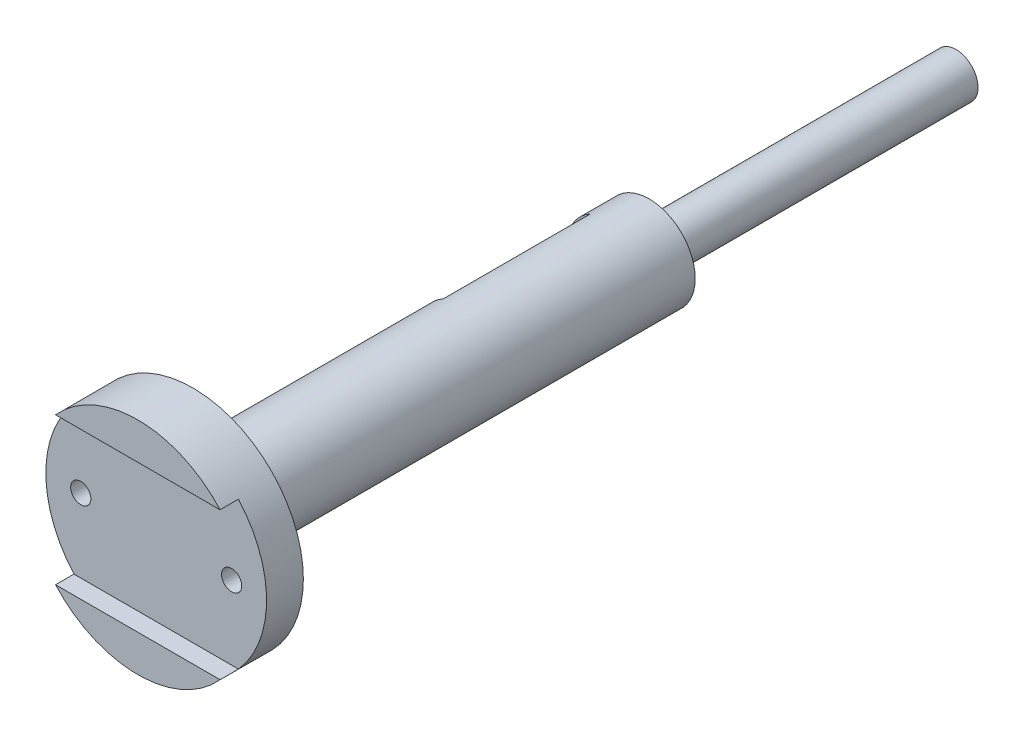
ISO-10303-21;
HEADER;
FILE_DESCRIPTION(('STEP AP214'),'2;1');
FILE_NAME('part.step','',(''),(''),'','','');
FILE_SCHEMA(('AUTOMOTIVE_DESIGN { 1 0 10303 214 1 1 1 1 }'));
ENDSEC;
DATA;
#1=APPLICATION_CONTEXT('core data for automotive mechanical design processes');
#2=APPLICATION_PROTOCOL_DEFINITION('international standard','automotive_design',2000,#1);
#3=PRODUCT_CONTEXT('',#1,'mechanical');
#4=PRODUCT('Part','Part','',(#3));
#5=PRODUCT_RELATED_PRODUCT_CATEGORY('part','',(#4));
#6=PRODUCT_DEFINITION_FORMATION('','',#4);
#7=PRODUCT_DEFINITION_CONTEXT('part definition',#1,'design');
#8=PRODUCT_DEFINITION('design','',#6,#7);
#9=PRODUCT_DEFINITION_SHAPE('','',#8);
#10=(LENGTH_UNIT() NAMED_UNIT(*) SI_UNIT(.MILLI.,.METRE.));
#11=(NAMED_UNIT(*) PLANE_ANGLE_UNIT() SI_UNIT($,.RADIAN.));
#12=(NAMED_UNIT(*) SI_UNIT($,.STERADIAN.) SOLID_ANGLE_UNIT());
#13=UNCERTAINTY_MEASURE_WITH_UNIT(LENGTH_MEASURE(1.E-05),#10,'distance_accuracy_value','');
#14=(GEOMETRIC_REPRESENTATION_CONTEXT(3) GLOBAL_UNCERTAINTY_ASSIGNED_CONTEXT((#13)) GLOBAL_UNIT_ASSIGNED_CONTEXT((#10,
#11,#12)) REPRESENTATION_CONTEXT('',''));
#15=CARTESIAN_POINT('',(0.,0.,0.));
#16=DIRECTION('',(0.,0.,1.));
#17=DIRECTION('',(1.,0.,0.));
#18=AXIS2_PLACEMENT_3D('',#15,#16,#17);
#19=CARTESIAN_POINT('',(-6.,10.9658560997307,-74.));
#20=DIRECTION('',(1.,0.,0.));
#21=DIRECTION('',(0.,0.,-1.));
#22=AXIS2_PLACEMENT_3D('',#19,#20,#21);
#23=PLANE('',#22);
#24=DIRECTION('',(0.,1.,0.));
#25=VECTOR('',#24,1.);
#26=CARTESIAN_POINT('',(-6.,10.9658560997307,-114.));
#27=LINE('',#26,#25);
#28=CARTESIAN_POINT('',(-6.,-10.9658560997307,-114.));
#29=VERTEX_POINT('',#28);
#30=CARTESIAN_POINT('',(-6.,10.9658560997307,-114.));
#31=VERTEX_POINT('',#30);
#32=EDGE_CURVE('E11',#29,#31,#27,.T.);
#33=ORIENTED_EDGE('',*,*,#32,.F.);
#34=DIRECTION('',(0.,0.,-1.));
#35=VECTOR('',#34,1.);
#36=CARTESIAN_POINT('',(-6.,-10.9658560997307,-74.));
#37=LINE('',#36,#35);
#38=CARTESIAN_POINT('',(-6.,-10.9658560997307,-74.));
#39=VERTEX_POINT('',#38);
#40=EDGE_CURVE('E113',#39,#29,#37,.T.);
#41=ORIENTED_EDGE('',*,*,#40,.F.);
#42=DIRECTION('',(0.,-1.,0.));
#43=VECTOR('',#42,1.);
#44=CARTESIAN_POINT('',(-6.,10.9658560997307,-74.));
#45=LINE('',#44,#43);
#46=CARTESIAN_POINT('',(-6.,10.9658560997307,-74.));
#47=VERTEX_POINT('',#46);
#48=EDGE_CURVE('E110',#47,#39,#45,.T.);
#49=ORIENTED_EDGE('',*,*,#48,.F.);
#50=DIRECTION('',(0.,0.,-1.));
#51=VECTOR('',#50,1.);
#52=CARTESIAN_POINT('',(-6.,10.9658560997307,-74.));
#53=LINE('',#52,#51);
#54=EDGE_CURVE('E50',#47,#31,#53,.T.);
#55=ORIENTED_EDGE('',*,*,#54,.T.);
#56=EDGE_LOOP('',(#33,#41,#49,#55));
#57=FACE_BOUND('',#56,.T.);
#58=ADVANCED_FACE('F35',(#57),#23,.F.);
#59=CARTESIAN_POINT('',(0.,0.,15.));
#60=DIRECTION('',(0.,0.,1.));
#61=DIRECTION('',(1.,0.,0.));
#62=AXIS2_PLACEMENT_3D('',#59,#60,#61);
#63=PLANE('',#62);
#64=DIRECTION('',(-1.,0.,0.));
#65=VECTOR('',#64,1.);
#66=CARTESIAN_POINT('',(0.,20.,15.));
#67=LINE('',#66,#65);
#68=CARTESIAN_POINT('',(22.3606797749979,20.,15.));
#69=VERTEX_POINT('',#68);
#70=CARTESIAN_POINT('',(-22.3606797749979,20.,15.));
#71=VERTEX_POINT('',#70);
#72=EDGE_CURVE('E212',#69,#71,#67,.T.);
#73=ORIENTED_EDGE('',*,*,#72,.F.);
#74=CARTESIAN_POINT('',(0.,0.,15.));
#75=DIRECTION('',(0.,0.,1.));
#76=DIRECTION('',(1.,0.,0.));
#77=AXIS2_PLACEMENT_3D('',#74,#75,#76);
#78=CIRCLE('',#77,30.);
#79=EDGE_CURVE('E201',#69,#71,#78,.T.);
#80=ORIENTED_EDGE('',*,*,#79,.T.);
#81=EDGE_LOOP('',(#73,#80));
#82=FACE_BOUND('',#81,.T.);
#83=ADVANCED_FACE('F256',(#82),#63,.T.);
#84=CARTESIAN_POINT('',(0.,0.,15.));
#85=DIRECTION('',(0.,0.,-1.));
#86=DIRECTION('',(-1.,0.,0.));
#87=AXIS2_PLACEMENT_3D('',#84,#85,#86);
#88=CYLINDRICAL_SURFACE('',#87,30.);
#89=ORIENTED_EDGE('',*,*,#79,.F.);
#90=DIRECTION('',(0.,0.,-1.));
#91=VECTOR('',#90,1.);
#92=CARTESIAN_POINT('',(22.3606797749979,20.,15.));
#93=LINE('',#92,#91);
#94=CARTESIAN_POINT('',(22.3606797749979,20.,10.));
#95=VERTEX_POINT('',#94);
#96=EDGE_CURVE('E194',#69,#95,#93,.T.);
#97=ORIENTED_EDGE('',*,*,#96,.T.);
#98=CARTESIAN_POINT('',(0.,0.,10.));
#99=DIRECTION('',(0.,0.,-1.));
#100=DIRECTION('',(-1.,0.,0.));
#101=AXIS2_PLACEMENT_3D('',#98,#99,#100);
#102=CIRCLE('',#101,30.);
#103=CARTESIAN_POINT('',(22.3606797749979,-20.,10.));
#104=VERTEX_POINT('',#103);
#105=EDGE_CURVE('E217',#95,#104,#102,.T.);
#106=ORIENTED_EDGE('',*,*,#105,.T.);
#107=DIRECTION('',(0.,0.,-1.));
#108=VECTOR('',#107,1.);
#109=CARTESIAN_POINT('',(22.3606797749979,-20.,15.));
#110=LINE('',#109,#108);
#111=CARTESIAN_POINT('',(22.3606797749979,-20.,15.));
#112=VERTEX_POINT('',#111);
#113=EDGE_CURVE('E185',#104,#112,#110,.F.);
#114=ORIENTED_EDGE('',*,*,#113,.T.);
#115=CARTESIAN_POINT('',(-22.3606797749979,-20.,15.));
#116=VERTEX_POINT('',#115);
#117=EDGE_CURVE('E205',#116,#112,#78,.T.);
#118=ORIENTED_EDGE('',*,*,#117,.F.);
#119=DIRECTION('',(0.,0.,-1.));
#120=VECTOR('',#119,1.);
#121=CARTESIAN_POINT('',(-22.3606797749979,-20.,15.));
#122=LINE('',#121,#120);
#123=CARTESIAN_POINT('',(-22.3606797749979,-20.,10.));
#124=VERTEX_POINT('',#123);
#125=EDGE_CURVE('E188',#116,#124,#122,.T.);
#126=ORIENTED_EDGE('',*,*,#125,.T.);
#127=CARTESIAN_POINT('',(-22.3606797749979,20.,10.));
#128=VERTEX_POINT('',#127);
#129=EDGE_CURVE('E214',#124,#128,#102,.T.);
#130=ORIENTED_EDGE('',*,*,#129,.T.);
#131=DIRECTION('',(0.,0.,-1.));
#132=VECTOR('',#131,1.);
#133=CARTESIAN_POINT('',(-22.3606797749979,20.,15.));
#134=LINE('',#133,#132);
#135=EDGE_CURVE('E191',#128,#71,#134,.F.);
#136=ORIENTED_EDGE('',*,*,#135,.T.);
#137=EDGE_LOOP('',(#89,#97,#106,#114,#118,#126,#130,#136));
#138=FACE_BOUND('',#137,.T.);
#139=CARTESIAN_POINT('',(0.,0.,0.));
#140=DIRECTION('',(0.,0.,1.));
#141=DIRECTION('',(1.,0.,0.));
#142=AXIS2_PLACEMENT_3D('',#139,#140,#141);
#143=CIRCLE('',#142,30.);
#144=CARTESIAN_POINT('',(30.,0.,0.));
#145=VERTEX_POINT('',#144);
#146=EDGE_CURVE('E200',#145,#145,#143,.T.);
#147=ORIENTED_EDGE('',*,*,#146,.T.);
#148=EDGE_LOOP('',(#147));
#149=FACE_BOUND('',#148,.T.);
#150=ADVANCED_FACE('F37',(#138,#149),#88,.T.);
#151=DIRECTION('',(1.,0.,0.));
#152=VECTOR('',#151,1.);
#153=CARTESIAN_POINT('',(0.,-20.,15.));
#154=LINE('',#153,#152);
#155=EDGE_CURVE('E210',#116,#112,#154,.T.);
#156=ORIENTED_EDGE('',*,*,#155,.F.);
#157=ORIENTED_EDGE('',*,*,#117,.T.);
#158=EDGE_LOOP('',(#156,#157));
#159=FACE_BOUND('',#158,.T.);
#160=ADVANCED_FACE('F263',(#159),#63,.T.);
#161=CARTESIAN_POINT('',(0.,0.,0.));
#162=DIRECTION('',(0.,0.,1.));
#163=DIRECTION('',(1.,0.,0.));
#164=AXIS2_PLACEMENT_3D('',#161,#162,#163);
#165=PLANE('',#164);
#166=CARTESIAN_POINT('',(-20.5,0.,0.));
#167=DIRECTION('',(0.,0.,-1.));
#168=DIRECTION('',(-1.,0.,0.));
#169=AXIS2_PLACEMENT_3D('',#166,#167,#168);
#170=CIRCLE('',#169,6.12);
#171=CARTESIAN_POINT('',(-26.62,0.,0.));
#172=VERTEX_POINT('',#171);
#173=EDGE_CURVE('E151',#172,#172,#170,.T.);
#174=ORIENTED_EDGE('',*,*,#173,.F.);
#175=EDGE_LOOP('',(#174));
#176=FACE_BOUND('',#175,.T.);
#177=CARTESIAN_POINT('',(20.5,0.,0.));
#178=DIRECTION('',(0.,0.,-1.));
#179=DIRECTION('',(-1.,0.,0.));
#180=AXIS2_PLACEMENT_3D('',#177,#178,#179);
#181=CIRCLE('',#180,6.12);
#182=CARTESIAN_POINT('',(14.38,0.,0.));
#183=VERTEX_POINT('',#182);
#184=EDGE_CURVE('E166',#183,#183,#181,.T.);
#185=ORIENTED_EDGE('',*,*,#184,.F.);
#186=EDGE_LOOP('',(#185));
#187=FACE_BOUND('',#186,.T.);
#188=CARTESIAN_POINT('',(0.,0.,0.));
#189=DIRECTION('',(0.,0.,1.));
#190=DIRECTION('',(1.,0.,0.));
#191=AXIS2_PLACEMENT_3D('',#188,#189,#190);
#192=CIRCLE('',#191,12.5);
#193=CARTESIAN_POINT('',(12.5,0.,0.));
#194=VERTEX_POINT('',#193);
#195=EDGE_CURVE('E204',#194,#194,#192,.F.);
#196=ORIENTED_EDGE('',*,*,#195,.F.);
#197=EDGE_LOOP('',(#196));
#198=FACE_BOUND('',#197,.T.);
#199=ORIENTED_EDGE('',*,*,#146,.F.);
#200=EDGE_LOOP('',(#199));
#201=FACE_BOUND('',#200,.T.);
#202=ADVANCED_FACE('F411',(#176,#187,#198,#201),#165,.F.);
#203=CARTESIAN_POINT('',(0.,0.,-124.));
#204=DIRECTION('',(0.,0.,1.));
#205=DIRECTION('',(1.,0.,0.));
#206=AXIS2_PLACEMENT_3D('',#203,#204,#205);
#207=CYLINDRICAL_SURFACE('',#206,12.5);
#208=CARTESIAN_POINT('',(0.,0.,-124.));
#209=DIRECTION('',(0.,0.,-1.));
#210=DIRECTION('',(-1.,0.,0.));
#211=AXIS2_PLACEMENT_3D('',#208,#209,#210);
#212=CIRCLE('',#211,12.5);
#213=CARTESIAN_POINT('',(-12.5,0.,-124.));
#214=VERTEX_POINT('',#213);
#215=EDGE_CURVE('E197',#214,#214,#212,.T.);
#216=ORIENTED_EDGE('',*,*,#215,.F.);
#217=EDGE_LOOP('',(#216));
#218=FACE_BOUND('',#217,.T.);
#219=CARTESIAN_POINT('',(0.,0.,-114.));
#220=DIRECTION('',(0.,0.,-1.));
#221=DIRECTION('',(-1.,0.,0.));
#222=AXIS2_PLACEMENT_3D('',#219,#220,#221);
#223=CIRCLE('',#222,12.5);
#224=EDGE_CURVE('E114',#29,#31,#223,.T.);
#225=ORIENTED_EDGE('',*,*,#224,.T.);
#226=ORIENTED_EDGE('',*,*,#54,.F.);
#227=CARTESIAN_POINT('',(0.,0.,-74.));
#228=DIRECTION('',(0.,0.,1.));
#229=DIRECTION('',(1.,0.,0.));
#230=AXIS2_PLACEMENT_3D('',#227,#228,#229);
#231=CIRCLE('',#230,12.5);
#232=EDGE_CURVE('E43',#47,#39,#231,.T.);
#233=ORIENTED_EDGE('',*,*,#232,.T.);
#234=ORIENTED_EDGE('',*,*,#40,.T.);
#235=EDGE_LOOP('',(#225,#226,#233,#234));
#236=FACE_BOUND('',#235,.T.);
#237=ORIENTED_EDGE('',*,*,#195,.T.);
#238=EDGE_LOOP('',(#237));
#239=FACE_BOUND('',#238,.T.);
#240=ADVANCED_FACE('F117',(#218,#236,#239),#207,.T.);
#241=CARTESIAN_POINT('',(0.,0.,-124.));
#242=DIRECTION('',(0.,0.,-1.));
#243=DIRECTION('',(-1.,0.,0.));
#244=AXIS2_PLACEMENT_3D('',#241,#242,#243);
#245=PLANE('',#244);
#246=ORIENTED_EDGE('',*,*,#215,.T.);
#247=EDGE_LOOP('',(#246));
#248=FACE_BOUND('',#247,.T.);
#249=CARTESIAN_POINT('',(0.,0.,-124.));
#250=DIRECTION('',(0.,0.,-1.));
#251=DIRECTION('',(-1.,0.,0.));
#252=AXIS2_PLACEMENT_3D('',#249,#250,#251);
#253=CIRCLE('',#252,6.);
#254=CARTESIAN_POINT('',(-6.,0.,-124.));
#255=VERTEX_POINT('',#254);
#256=EDGE_CURVE('E147',#255,#255,#253,.T.);
#257=ORIENTED_EDGE('',*,*,#256,.F.);
#258=EDGE_LOOP('',(#257));
#259=FACE_BOUND('',#258,.T.);
#260=ADVANCED_FACE('F401',(#248,#259),#245,.T.);
#261=CARTESIAN_POINT('',(0.,0.,10.));
#262=DIRECTION('',(0.,0.,-1.));
#263=DIRECTION('',(-1.,0.,0.));
#264=AXIS2_PLACEMENT_3D('',#261,#262,#263);
#265=PLANE('',#264);
#266=CARTESIAN_POINT('',(-20.5,0.,10.));
#267=DIRECTION('',(0.,0.,-1.));
#268=DIRECTION('',(-1.,0.,0.));
#269=AXIS2_PLACEMENT_3D('',#266,#267,#268);
#270=CIRCLE('',#269,2.75);
#271=CARTESIAN_POINT('',(-23.25,0.,10.));
#272=VERTEX_POINT('',#271);
#273=EDGE_CURVE('E165',#272,#272,#270,.T.);
#274=ORIENTED_EDGE('',*,*,#273,.T.);
#275=EDGE_LOOP('',(#274));
#276=FACE_BOUND('',#275,.T.);
#277=CARTESIAN_POINT('',(20.5,0.,10.));
#278=DIRECTION('',(0.,0.,-1.));
#279=DIRECTION('',(-1.,0.,0.));
#280=AXIS2_PLACEMENT_3D('',#277,#278,#279);
#281=CIRCLE('',#280,2.75);
#282=CARTESIAN_POINT('',(17.75,0.,10.));
#283=VERTEX_POINT('',#282);
#284=EDGE_CURVE('E178',#283,#283,#281,.T.);
#285=ORIENTED_EDGE('',*,*,#284,.T.);
#286=EDGE_LOOP('',(#285));
#287=FACE_BOUND('',#286,.T.);
#288=DIRECTION('',(-1.,0.,0.));
#289=VECTOR('',#288,1.);
#290=CARTESIAN_POINT('',(115.,20.,10.));
#291=LINE('',#290,#289);
#292=EDGE_CURVE('E182',#95,#128,#291,.T.);
#293=ORIENTED_EDGE('',*,*,#292,.T.);
#294=ORIENTED_EDGE('',*,*,#129,.F.);
#295=DIRECTION('',(1.,0.,0.));
#296=VECTOR('',#295,1.);
#297=CARTESIAN_POINT('',(115.,-20.,10.));
#298=LINE('',#297,#296);
#299=EDGE_CURVE('E179',#124,#104,#298,.T.);
#300=ORIENTED_EDGE('',*,*,#299,.T.);
#301=ORIENTED_EDGE('',*,*,#105,.F.);
#302=EDGE_LOOP('',(#293,#294,#300,#301));
#303=FACE_BOUND('',#302,.T.);
#304=ADVANCED_FACE('F395',(#276,#287,#303),#265,.F.);
#305=CARTESIAN_POINT('',(115.,20.,10.));
#306=DIRECTION('',(0.,1.,0.));
#307=DIRECTION('',(-1.,0.,0.));
#308=AXIS2_PLACEMENT_3D('',#305,#306,#307);
#309=PLANE('',#308);
#310=ORIENTED_EDGE('',*,*,#72,.T.);
#311=ORIENTED_EDGE('',*,*,#135,.F.);
#312=ORIENTED_EDGE('',*,*,#292,.F.);
#313=ORIENTED_EDGE('',*,*,#96,.F.);
#314=EDGE_LOOP('',(#310,#311,#312,#313));
#315=FACE_BOUND('',#314,.T.);
#316=ADVANCED_FACE('F400',(#315),#309,.F.);
#317=CARTESIAN_POINT('',(115.,-20.,10.));
#318=DIRECTION('',(0.,-1.,0.));
#319=DIRECTION('',(1.,0.,0.));
#320=AXIS2_PLACEMENT_3D('',#317,#318,#319);
#321=PLANE('',#320);
#322=ORIENTED_EDGE('',*,*,#155,.T.);
#323=ORIENTED_EDGE('',*,*,#113,.F.);
#324=ORIENTED_EDGE('',*,*,#299,.F.);
#325=ORIENTED_EDGE('',*,*,#125,.F.);
#326=EDGE_LOOP('',(#322,#323,#324,#325));
#327=FACE_BOUND('',#326,.T.);
#328=ADVANCED_FACE('F387',(#327),#321,.F.);
#329=CARTESIAN_POINT('',(20.5,0.,0.));
#330=DIRECTION('',(0.,0.,-1.));
#331=DIRECTION('',(-1.,0.,0.));
#332=AXIS2_PLACEMENT_3D('',#329,#330,#331);
#333=CYLINDRICAL_SURFACE('',#332,2.75);
#334=CARTESIAN_POINT('',(20.5,0.,3.60500000000001));
#335=DIRECTION('',(0.,0.,-1.));
#336=DIRECTION('',(-1.,0.,0.));
#337=AXIS2_PLACEMENT_3D('',#334,#335,#336);
#338=CIRCLE('',#337,2.75);
#339=CARTESIAN_POINT('',(17.75,0.,3.60500000000001));
#340=VERTEX_POINT('',#339);
#341=EDGE_CURVE('E175',#340,#340,#338,.T.);
#342=ORIENTED_EDGE('',*,*,#341,.T.);
#343=EDGE_LOOP('',(#342));
#344=FACE_BOUND('',#343,.T.);
#345=ORIENTED_EDGE('',*,*,#284,.F.);
#346=EDGE_LOOP('',(#345));
#347=FACE_BOUND('',#346,.T.);
#348=ADVANCED_FACE('F377',(#344,#347),#333,.F.);
#349=CARTESIAN_POINT('',(20.5,0.,3.58));
#350=DIRECTION('',(0.,0.,-1.));
#351=DIRECTION('',(-1.,0.,0.));
#352=AXIS2_PLACEMENT_3D('',#349,#350,#351);
#353=CONICAL_SURFACE('',#352,2.775,0.785398163397292);
#354=ORIENTED_EDGE('',*,*,#341,.F.);
#355=EDGE_LOOP('',(#354));
#356=FACE_BOUND('',#355,.T.);
#357=CARTESIAN_POINT('',(20.5,0.,3.58));
#358=DIRECTION('',(0.,0.,-1.));
#359=DIRECTION('',(-1.,0.,0.));
#360=AXIS2_PLACEMENT_3D('',#357,#358,#359);
#361=CIRCLE('',#360,2.775);
#362=CARTESIAN_POINT('',(17.725,0.,3.58));
#363=VERTEX_POINT('',#362);
#364=EDGE_CURVE('E172',#363,#363,#361,.T.);
#365=ORIENTED_EDGE('',*,*,#364,.T.);
#366=EDGE_LOOP('',(#365));
#367=FACE_BOUND('',#366,.T.);
#368=ADVANCED_FACE('F367',(#356,#367),#353,.F.);
#369=CARTESIAN_POINT('',(23.275,0.,3.58));
#370=DIRECTION('',(0.,0.,1.));
#371=DIRECTION('',(1.,0.,0.));
#372=AXIS2_PLACEMENT_3D('',#369,#370,#371);
#373=PLANE('',#372);
#374=ORIENTED_EDGE('',*,*,#364,.F.);
#375=EDGE_LOOP('',(#374));
#376=FACE_BOUND('',#375,.T.);
#377=CARTESIAN_POINT('',(20.5,0.,3.58));
#378=DIRECTION('',(0.,0.,-1.));
#379=DIRECTION('',(-1.,0.,0.));
#380=AXIS2_PLACEMENT_3D('',#377,#378,#379);
#381=CIRCLE('',#380,6.12);
#382=CARTESIAN_POINT('',(14.38,0.,3.58));
#383=VERTEX_POINT('',#382);
#384=EDGE_CURVE('E169',#383,#383,#381,.T.);
#385=ORIENTED_EDGE('',*,*,#384,.T.);
#386=EDGE_LOOP('',(#385));
#387=FACE_BOUND('',#386,.T.);
#388=ADVANCED_FACE('F357',(#376,#387),#373,.F.);
#389=CARTESIAN_POINT('',(20.5,0.,0.));
#390=DIRECTION('',(0.,0.,-1.));
#391=DIRECTION('',(-1.,0.,0.));
#392=AXIS2_PLACEMENT_3D('',#389,#390,#391);
#393=CYLINDRICAL_SURFACE('',#392,6.12);
#394=ORIENTED_EDGE('',*,*,#384,.F.);
#395=EDGE_LOOP('',(#394));
#396=FACE_BOUND('',#395,.T.);
#397=ORIENTED_EDGE('',*,*,#184,.T.);
#398=EDGE_LOOP('',(#397));
#399=FACE_BOUND('',#398,.T.);
#400=ADVANCED_FACE('F347',(#396,#399),#393,.F.);
#401=CARTESIAN_POINT('',(-20.5,0.,0.));
#402=DIRECTION('',(0.,0.,-1.));
#403=DIRECTION('',(-1.,0.,0.));
#404=AXIS2_PLACEMENT_3D('',#401,#402,#403);
#405=CYLINDRICAL_SURFACE('',#404,2.75);
#406=CARTESIAN_POINT('',(-20.5,0.,3.60500000000001));
#407=DIRECTION('',(0.,0.,-1.));
#408=DIRECTION('',(-1.,0.,0.));
#409=AXIS2_PLACEMENT_3D('',#406,#407,#408);
#410=CIRCLE('',#409,2.75);
#411=CARTESIAN_POINT('',(-23.25,0.,3.60500000000001));
#412=VERTEX_POINT('',#411);
#413=EDGE_CURVE('E162',#412,#412,#410,.T.);
#414=ORIENTED_EDGE('',*,*,#413,.T.);
#415=EDGE_LOOP('',(#414));
#416=FACE_BOUND('',#415,.T.);
#417=ORIENTED_EDGE('',*,*,#273,.F.);
#418=EDGE_LOOP('',(#417));
#419=FACE_BOUND('',#418,.T.);
#420=ADVANCED_FACE('F337',(#416,#419),#405,.F.);
#421=CARTESIAN_POINT('',(-20.5,0.,3.58));
#422=DIRECTION('',(0.,0.,-1.));
#423=DIRECTION('',(-1.,0.,0.));
#424=AXIS2_PLACEMENT_3D('',#421,#422,#423);
#425=CONICAL_SURFACE('',#424,2.775,0.785398163397292);
#426=ORIENTED_EDGE('',*,*,#413,.F.);
#427=EDGE_LOOP('',(#426));
#428=FACE_BOUND('',#427,.T.);
#429=CARTESIAN_POINT('',(-20.5,0.,3.58));
#430=DIRECTION('',(0.,0.,-1.));
#431=DIRECTION('',(-1.,0.,0.));
#432=AXIS2_PLACEMENT_3D('',#429,#430,#431);
#433=CIRCLE('',#432,2.775);
#434=CARTESIAN_POINT('',(-23.275,0.,3.58));
#435=VERTEX_POINT('',#434);
#436=EDGE_CURVE('E159',#435,#435,#433,.T.);
#437=ORIENTED_EDGE('',*,*,#436,.T.);
#438=EDGE_LOOP('',(#437));
#439=FACE_BOUND('',#438,.T.);
#440=ADVANCED_FACE('F327',(#428,#439),#425,.F.);
#441=CARTESIAN_POINT('',(-17.725,0.,3.58));
#442=DIRECTION('',(0.,0.,1.));
#443=DIRECTION('',(1.,0.,0.));
#444=AXIS2_PLACEMENT_3D('',#441,#442,#443);
#445=PLANE('',#444);
#446=ORIENTED_EDGE('',*,*,#436,.F.);
#447=EDGE_LOOP('',(#446));
#448=FACE_BOUND('',#447,.T.);
#449=CARTESIAN_POINT('',(-20.5,0.,3.58));
#450=DIRECTION('',(0.,0.,-1.));
#451=DIRECTION('',(-1.,0.,0.));
#452=AXIS2_PLACEMENT_3D('',#449,#450,#451);
#453=CIRCLE('',#452,6.12);
#454=CARTESIAN_POINT('',(-26.62,0.,3.58));
#455=VERTEX_POINT('',#454);
#456=EDGE_CURVE('E156',#455,#455,#453,.T.);
#457=ORIENTED_EDGE('',*,*,#456,.T.);
#458=EDGE_LOOP('',(#457));
#459=FACE_BOUND('',#458,.T.);
#460=ADVANCED_FACE('F317',(#448,#459),#445,.F.);
#461=CARTESIAN_POINT('',(-20.5,0.,0.));
#462=DIRECTION('',(0.,0.,-1.));
#463=DIRECTION('',(-1.,0.,0.));
#464=AXIS2_PLACEMENT_3D('',#461,#462,#463);
#465=CYLINDRICAL_SURFACE('',#464,6.12);
#466=ORIENTED_EDGE('',*,*,#456,.F.);
#467=EDGE_LOOP('',(#466));
#468=FACE_BOUND('',#467,.T.);
#469=ORIENTED_EDGE('',*,*,#173,.T.);
#470=EDGE_LOOP('',(#469));
#471=FACE_BOUND('',#470,.T.);
#472=ADVANCED_FACE('F312',(#468,#471),#465,.F.);
#473=CARTESIAN_POINT('',(0.,0.,-207.38));
#474=DIRECTION('',(0.,0.,1.));
#475=DIRECTION('',(1.,0.,0.));
#476=AXIS2_PLACEMENT_3D('',#473,#474,#475);
#477=CYLINDRICAL_SURFACE('',#476,6.);
#478=CARTESIAN_POINT('',(0.,0.,-204.38));
#479=DIRECTION('',(0.,0.,-1.));
#480=DIRECTION('',(-1.,0.,0.));
#481=AXIS2_PLACEMENT_3D('',#478,#479,#480);
#482=CIRCLE('',#481,6.);
#483=CARTESIAN_POINT('',(-5.80947501931113,-1.5,-204.38));
#484=VERTEX_POINT('',#483);
#485=CARTESIAN_POINT('',(-5.80947501931113,1.5,-204.38));
#486=VERTEX_POINT('',#485);
#487=EDGE_CURVE('E112',#484,#486,#482,.T.);
#488=ORIENTED_EDGE('',*,*,#487,.F.);
#489=DIRECTION('',(0.,0.,1.));
#490=VECTOR('',#489,1.);
#491=CARTESIAN_POINT('',(-5.80947501931113,-1.5,-207.38));
#492=LINE('',#491,#490);
#493=CARTESIAN_POINT('',(-5.80947501931113,-1.5,-207.38));
#494=VERTEX_POINT('',#493);
#495=EDGE_CURVE('E144',#484,#494,#492,.F.);
#496=ORIENTED_EDGE('',*,*,#495,.T.);
#497=CARTESIAN_POINT('',(0.,0.,-207.38));
#498=DIRECTION('',(0.,0.,-1.));
#499=DIRECTION('',(-1.,0.,0.));
#500=AXIS2_PLACEMENT_3D('',#497,#498,#499);
#501=CIRCLE('',#500,6.);
#502=CARTESIAN_POINT('',(-5.80947501931113,1.5,-207.38));
#503=VERTEX_POINT('',#502);
#504=EDGE_CURVE('E148',#503,#494,#501,.T.);
#505=ORIENTED_EDGE('',*,*,#504,.F.);
#506=DIRECTION('',(0.,0.,1.));
#507=VECTOR('',#506,1.);
#508=CARTESIAN_POINT('',(-5.80947501931113,1.5,-207.38));
#509=LINE('',#508,#507);
#510=EDGE_CURVE('E139',#503,#486,#509,.T.);
#511=ORIENTED_EDGE('',*,*,#510,.T.);
#512=EDGE_LOOP('',(#488,#496,#505,#511));
#513=FACE_BOUND('',#512,.T.);
#514=ORIENTED_EDGE('',*,*,#256,.T.);
#515=EDGE_LOOP('',(#514));
#516=FACE_BOUND('',#515,.T.);
#517=ADVANCED_FACE('F236',(#513,#516),#477,.T.);
#518=CARTESIAN_POINT('',(0.,0.,-207.38));
#519=DIRECTION('',(0.,0.,-1.));
#520=DIRECTION('',(-1.,0.,0.));
#521=AXIS2_PLACEMENT_3D('',#518,#519,#520);
#522=PLANE('',#521);
#523=DIRECTION('',(-1.,0.,0.));
#524=VECTOR('',#523,1.);
#525=CARTESIAN_POINT('',(3.39095353514196,-1.5,-207.38));
#526=LINE('',#525,#524);
#527=CARTESIAN_POINT('',(3.39095353514196,-1.5,-207.38));
#528=VERTEX_POINT('',#527);
#529=EDGE_CURVE('E127',#528,#494,#526,.T.);
#530=ORIENTED_EDGE('',*,*,#529,.F.);
#531=DIRECTION('',(0.,-1.,0.));
#532=VECTOR('',#531,1.);
#533=CARTESIAN_POINT('',(3.39095353514196,1.5,-207.38));
#534=LINE('',#533,#532);
#535=CARTESIAN_POINT('',(3.39095353514196,1.5,-207.38));
#536=VERTEX_POINT('',#535);
#537=EDGE_CURVE('E121',#536,#528,#534,.T.);
#538=ORIENTED_EDGE('',*,*,#537,.F.);
#539=DIRECTION('',(1.,0.,0.));
#540=VECTOR('',#539,1.);
#541=CARTESIAN_POINT('',(0.,1.5,-207.38));
#542=LINE('',#541,#540);
#543=EDGE_CURVE('E222',#503,#536,#542,.T.);
#544=ORIENTED_EDGE('',*,*,#543,.F.);
#545=ORIENTED_EDGE('',*,*,#504,.T.);
#546=EDGE_LOOP('',(#530,#538,#544,#545));
#547=FACE_BOUND('',#546,.T.);
#548=ADVANCED_FACE('F240',(#547),#522,.T.);
#549=CARTESIAN_POINT('',(0.,0.,-204.38));
#550=DIRECTION('',(0.,0.,-1.));
#551=DIRECTION('',(-1.,0.,0.));
#552=AXIS2_PLACEMENT_3D('',#549,#550,#551);
#553=PLANE('',#552);
#554=ORIENTED_EDGE('',*,*,#487,.T.);
#555=DIRECTION('',(1.,0.,0.));
#556=VECTOR('',#555,1.);
#557=CARTESIAN_POINT('',(3.39095353514196,1.5,-204.38));
#558=LINE('',#557,#556);
#559=CARTESIAN_POINT('',(3.39095353514196,1.5,-204.38));
#560=VERTEX_POINT('',#559);
#561=EDGE_CURVE('E124',#486,#560,#558,.T.);
#562=ORIENTED_EDGE('',*,*,#561,.T.);
#563=DIRECTION('',(0.,-1.,0.));
#564=VECTOR('',#563,1.);
#565=CARTESIAN_POINT('',(3.39095353514196,1.5,-204.38));
#566=LINE('',#565,#564);
#567=CARTESIAN_POINT('',(3.39095353514196,-1.5,-204.38));
#568=VERTEX_POINT('',#567);
#569=EDGE_CURVE('E126',#560,#568,#566,.T.);
#570=ORIENTED_EDGE('',*,*,#569,.T.);
#571=DIRECTION('',(-1.,0.,0.));
#572=VECTOR('',#571,1.);
#573=CARTESIAN_POINT('',(3.39095353514196,-1.5,-204.38));
#574=LINE('',#573,#572);
#575=EDGE_CURVE('E130',#568,#484,#574,.T.);
#576=ORIENTED_EDGE('',*,*,#575,.T.);
#577=EDGE_LOOP('',(#554,#562,#570,#576));
#578=FACE_BOUND('',#577,.T.);
#579=ADVANCED_FACE('F227',(#578),#553,.T.);
#580=CARTESIAN_POINT('',(3.39095353514196,-1.5,-204.38));
#581=DIRECTION('',(0.,-1.,0.));
#582=DIRECTION('',(0.,0.,-1.));
#583=AXIS2_PLACEMENT_3D('',#580,#581,#582);
#584=PLANE('',#583);
#585=ORIENTED_EDGE('',*,*,#575,.F.);
#586=DIRECTION('',(0.,0.,-1.));
#587=VECTOR('',#586,1.);
#588=CARTESIAN_POINT('',(3.39095353514196,-1.5,-204.38));
#589=LINE('',#588,#587);
#590=EDGE_CURVE('E137',#568,#528,#589,.T.);
#591=ORIENTED_EDGE('',*,*,#590,.T.);
#592=ORIENTED_EDGE('',*,*,#529,.T.);
#593=ORIENTED_EDGE('',*,*,#495,.F.);
#594=EDGE_LOOP('',(#585,#591,#592,#593));
#595=FACE_BOUND('',#594,.T.);
#596=ADVANCED_FACE('F245',(#595),#584,.F.);
#597=CARTESIAN_POINT('',(3.39095353514196,1.5,-204.38));
#598=DIRECTION('',(0.,1.,0.));
#599=DIRECTION('',(0.,0.,1.));
#600=AXIS2_PLACEMENT_3D('',#597,#598,#599);
#601=PLANE('',#600);
#602=ORIENTED_EDGE('',*,*,#543,.T.);
#603=DIRECTION('',(0.,0.,-1.));
#604=VECTOR('',#603,1.);
#605=CARTESIAN_POINT('',(3.39095353514196,1.5,-204.38));
#606=LINE('',#605,#604);
#607=EDGE_CURVE('E133',#560,#536,#606,.T.);
#608=ORIENTED_EDGE('',*,*,#607,.F.);
#609=ORIENTED_EDGE('',*,*,#561,.F.);
#610=ORIENTED_EDGE('',*,*,#510,.F.);
#611=EDGE_LOOP('',(#602,#608,#609,#610));
#612=FACE_BOUND('',#611,.T.);
#613=ADVANCED_FACE('F232',(#612),#601,.F.);
#614=CARTESIAN_POINT('',(3.39095353514196,1.5,-204.38));
#615=DIRECTION('',(1.,0.,0.));
#616=DIRECTION('',(0.,1.,0.));
#617=AXIS2_PLACEMENT_3D('',#614,#615,#616);
#618=PLANE('',#617);
#619=ORIENTED_EDGE('',*,*,#537,.T.);
#620=ORIENTED_EDGE('',*,*,#590,.F.);
#621=ORIENTED_EDGE('',*,*,#569,.F.);
#622=ORIENTED_EDGE('',*,*,#607,.T.);
#623=EDGE_LOOP('',(#619,#620,#621,#622));
#624=FACE_BOUND('',#623,.T.);
#625=ADVANCED_FACE('F243',(#624),#618,.F.);
#626=CARTESIAN_POINT('',(0.,0.,-74.));
#627=DIRECTION('',(0.,0.,1.));
#628=DIRECTION('',(1.,0.,0.));
#629=AXIS2_PLACEMENT_3D('',#626,#627,#628);
#630=PLANE('',#629);
#631=ORIENTED_EDGE('',*,*,#48,.T.);
#632=ORIENTED_EDGE('',*,*,#232,.F.);
#633=EDGE_LOOP('',(#631,#632));
#634=FACE_BOUND('',#633,.T.);
#635=ADVANCED_FACE('F109',(#634),#630,.F.);
#636=CARTESIAN_POINT('',(0.,0.,-114.));
#637=DIRECTION('',(0.,0.,-1.));
#638=DIRECTION('',(-1.,0.,0.));
#639=AXIS2_PLACEMENT_3D('',#636,#637,#638);
#640=PLANE('',#639);
#641=ORIENTED_EDGE('',*,*,#224,.F.);
#642=ORIENTED_EDGE('',*,*,#32,.T.);
#643=EDGE_LOOP('',(#641,#642));
#644=FACE_BOUND('',#643,.T.);
#645=ADVANCED_FACE('F267',(#644),#640,.F.);
#646=CLOSED_SHELL('',(#58,#83,#150,#160,#202,#240,#260,#304,#316,#328,#348,#368,#388,#400,#420,
#440,#460,#472,#517,#548,#579,#596,#613,#625,#635,#645));
#647=MANIFOLD_SOLID_BREP('B2',#646);
#648=ADVANCED_BREP_SHAPE_REPRESENTATION('',(#18,#647),#14);
#649=SHAPE_DEFINITION_REPRESENTATION(#9,#648);
ENDSEC;
END-ISO-10303-21;
